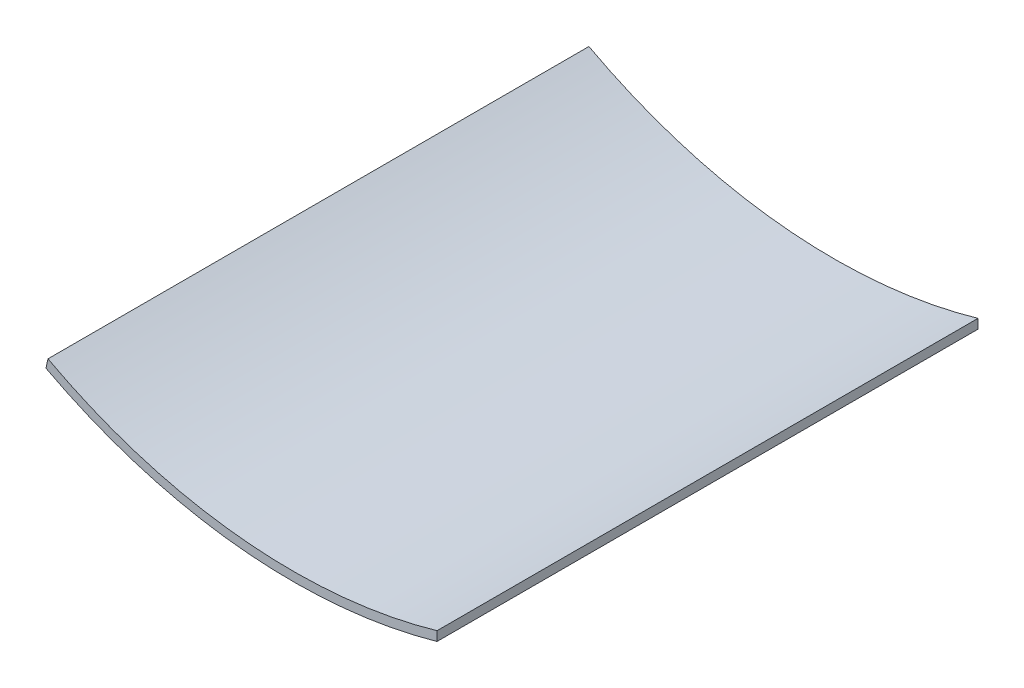
ISO-10303-21;
HEADER;
FILE_DESCRIPTION(('STEP AP214'),'2;1');
FILE_NAME('part.step','',(''),(''),'','','');
FILE_SCHEMA(('AUTOMOTIVE_DESIGN { 1 0 10303 214 1 1 1 1 }'));
ENDSEC;
DATA;
#1=APPLICATION_CONTEXT('core data for automotive mechanical design processes');
#2=APPLICATION_PROTOCOL_DEFINITION('international standard','automotive_design',2000,#1);
#3=PRODUCT_CONTEXT('',#1,'mechanical');
#4=PRODUCT('Part','Part','',(#3));
#5=PRODUCT_RELATED_PRODUCT_CATEGORY('part','',(#4));
#6=PRODUCT_DEFINITION_FORMATION('','',#4);
#7=PRODUCT_DEFINITION_CONTEXT('part definition',#1,'design');
#8=PRODUCT_DEFINITION('design','',#6,#7);
#9=PRODUCT_DEFINITION_SHAPE('','',#8);
#10=(LENGTH_UNIT() NAMED_UNIT(*) SI_UNIT(.MILLI.,.METRE.));
#11=(NAMED_UNIT(*) PLANE_ANGLE_UNIT() SI_UNIT($,.RADIAN.));
#12=(NAMED_UNIT(*) SI_UNIT($,.STERADIAN.) SOLID_ANGLE_UNIT());
#13=UNCERTAINTY_MEASURE_WITH_UNIT(LENGTH_MEASURE(1.E-05),#10,'distance_accuracy_value','');
#14=(GEOMETRIC_REPRESENTATION_CONTEXT(3) GLOBAL_UNCERTAINTY_ASSIGNED_CONTEXT((#13)) GLOBAL_UNIT_ASSIGNED_CONTEXT((#10,
#11,#12)) REPRESENTATION_CONTEXT('',''));
#15=CARTESIAN_POINT('',(0.,0.,0.));
#16=DIRECTION('',(0.,0.,1.));
#17=DIRECTION('',(1.,0.,0.));
#18=AXIS2_PLACEMENT_3D('',#15,#16,#17);
#19=CARTESIAN_POINT('',(0.,3.33066907387547E-13,190.5));
#20=DIRECTION('',(0.,0.,-1.));
#21=DIRECTION('',(-1.,0.,0.));
#22=AXIS2_PLACEMENT_3D('',#19,#20,#21);
#23=CYLINDRICAL_SURFACE('',#22,186.055);
#24=CARTESIAN_POINT('',(0.,3.33066907387547E-13,0.));
#25=DIRECTION('',(0.,0.,1.));
#26=DIRECTION('',(1.,0.,0.));
#27=AXIS2_PLACEMENT_3D('',#24,#25,#26);
#28=CIRCLE('',#27,186.055);
#29=CARTESIAN_POINT('',(-86.9030840778277,-164.512361246084,0.));
#30=VERTEX_POINT('',#29);
#31=CARTESIAN_POINT('',(50.8,-178.985538591809,0.));
#32=VERTEX_POINT('',#31);
#33=EDGE_CURVE('E115',#30,#32,#28,.T.);
#34=ORIENTED_EDGE('',*,*,#33,.T.);
#35=DIRECTION('',(0.,0.,-1.));
#36=VECTOR('',#35,1.);
#37=CARTESIAN_POINT('',(50.8,-178.985538591809,190.5));
#38=LINE('',#37,#36);
#39=CARTESIAN_POINT('',(50.8,-178.985538591809,190.5));
#40=VERTEX_POINT('',#39);
#41=EDGE_CURVE('E11',#40,#32,#38,.T.);
#42=ORIENTED_EDGE('',*,*,#41,.F.);
#43=CARTESIAN_POINT('',(0.,3.33066907387547E-13,190.5));
#44=DIRECTION('',(0.,0.,1.));
#45=DIRECTION('',(1.,0.,0.));
#46=AXIS2_PLACEMENT_3D('',#43,#44,#45);
#47=CIRCLE('',#46,186.055);
#48=CARTESIAN_POINT('',(-86.9030840778277,-164.512361246084,190.5));
#49=VERTEX_POINT('',#48);
#50=EDGE_CURVE('E99',#49,#40,#47,.T.);
#51=ORIENTED_EDGE('',*,*,#50,.F.);
#52=DIRECTION('',(0.,0.,-1.));
#53=VECTOR('',#52,1.);
#54=CARTESIAN_POINT('',(-86.9030840778277,-164.512361246084,190.5));
#55=LINE('',#54,#53);
#56=EDGE_CURVE('E111',#49,#30,#55,.T.);
#57=ORIENTED_EDGE('',*,*,#56,.T.);
#58=EDGE_LOOP('',(#34,#42,#51,#57));
#59=FACE_BOUND('',#58,.T.);
#60=ADVANCED_FACE('F47',(#59),#23,.T.);
#61=CARTESIAN_POINT('',(50.8,-178.985538591809,190.5));
#62=DIRECTION('',(-1.,0.,0.));
#63=DIRECTION('',(0.,0.,1.));
#64=AXIS2_PLACEMENT_3D('',#61,#62,#63);
#65=PLANE('',#64);
#66=DIRECTION('',(0.,1.,0.));
#67=VECTOR('',#66,1.);
#68=CARTESIAN_POINT('',(50.8,-178.985538591809,0.));
#69=LINE('',#68,#67);
#70=CARTESIAN_POINT('',(50.8,-175.682823292432,0.));
#71=VERTEX_POINT('',#70);
#72=EDGE_CURVE('E104',#32,#71,#69,.T.);
#73=ORIENTED_EDGE('',*,*,#72,.T.);
#74=DIRECTION('',(0.,0.,-1.));
#75=VECTOR('',#74,1.);
#76=CARTESIAN_POINT('',(50.8,-175.682823292432,190.5));
#77=LINE('',#76,#75);
#78=CARTESIAN_POINT('',(50.8,-175.682823292432,190.5));
#79=VERTEX_POINT('',#78);
#80=EDGE_CURVE('E56',#79,#71,#77,.T.);
#81=ORIENTED_EDGE('',*,*,#80,.F.);
#82=DIRECTION('',(0.,1.,0.));
#83=VECTOR('',#82,1.);
#84=CARTESIAN_POINT('',(50.8,-178.985538591809,190.5));
#85=LINE('',#84,#83);
#86=EDGE_CURVE('E94',#40,#79,#85,.T.);
#87=ORIENTED_EDGE('',*,*,#86,.F.);
#88=ORIENTED_EDGE('',*,*,#41,.T.);
#89=EDGE_LOOP('',(#73,#81,#87,#88));
#90=FACE_BOUND('',#89,.T.);
#91=ADVANCED_FACE('F103',(#90),#65,.F.);
#92=CARTESIAN_POINT('',(4.33680868994202E-13,2.02615701994091E-12,190.5));
#93=DIRECTION('',(0.,0.,-1.));
#94=DIRECTION('',(-1.,0.,0.));
#95=AXIS2_PLACEMENT_3D('',#92,#93,#94);
#96=CYLINDRICAL_SURFACE('',#95,182.880000000002);
#97=CARTESIAN_POINT('',(4.33680868994202E-13,2.02615701994091E-12,0.));
#98=DIRECTION('',(0.,0.,-1.));
#99=DIRECTION('',(1.,0.,0.));
#100=AXIS2_PLACEMENT_3D('',#97,#98,#99);
#101=CIRCLE('',#100,182.880000000002);
#102=CARTESIAN_POINT('',(-86.2164109556446,-161.281818200092,0.));
#103=VERTEX_POINT('',#102);
#104=EDGE_CURVE('E81',#71,#103,#101,.T.);
#105=ORIENTED_EDGE('',*,*,#104,.T.);
#106=DIRECTION('',(0.,0.,-1.));
#107=VECTOR('',#106,1.);
#108=CARTESIAN_POINT('',(-86.2164109556446,-161.281818200092,190.5));
#109=LINE('',#108,#107);
#110=CARTESIAN_POINT('',(-86.2164109556446,-161.281818200092,190.5));
#111=VERTEX_POINT('',#110);
#112=EDGE_CURVE('E106',#111,#103,#109,.T.);
#113=ORIENTED_EDGE('',*,*,#112,.F.);
#114=CARTESIAN_POINT('',(4.33680868994202E-13,2.02615701994091E-12,190.5));
#115=DIRECTION('',(0.,0.,-1.));
#116=DIRECTION('',(1.,0.,0.));
#117=AXIS2_PLACEMENT_3D('',#114,#115,#116);
#118=CIRCLE('',#117,182.880000000002);
#119=EDGE_CURVE('E97',#79,#111,#118,.T.);
#120=ORIENTED_EDGE('',*,*,#119,.F.);
#121=ORIENTED_EDGE('',*,*,#80,.T.);
#122=EDGE_LOOP('',(#105,#113,#120,#121));
#123=FACE_BOUND('',#122,.T.);
#124=ADVANCED_FACE('F107',(#123),#96,.F.);
#125=CARTESIAN_POINT('',(-86.9030840778277,-164.512361246084,190.5));
#126=DIRECTION('',(0.978147600733806,-0.207911690817756,0.));
#127=DIRECTION('',(0.207911690817756,0.978147600733806,0.));
#128=AXIS2_PLACEMENT_3D('',#125,#126,#127);
#129=PLANE('',#128);
#130=DIRECTION('',(-0.207911690817756,-0.978147600733807,0.));
#131=VECTOR('',#130,1.);
#132=CARTESIAN_POINT('',(-86.9030840778277,-164.512361246084,0.));
#133=LINE('',#132,#131);
#134=EDGE_CURVE('E87',#103,#30,#133,.T.);
#135=ORIENTED_EDGE('',*,*,#134,.T.);
#136=ORIENTED_EDGE('',*,*,#56,.F.);
#137=DIRECTION('',(-0.207911690817756,-0.978147600733807,0.));
#138=VECTOR('',#137,1.);
#139=CARTESIAN_POINT('',(-86.9030840778277,-164.512361246084,190.5));
#140=LINE('',#139,#138);
#141=EDGE_CURVE('E64',#111,#49,#140,.T.);
#142=ORIENTED_EDGE('',*,*,#141,.F.);
#143=ORIENTED_EDGE('',*,*,#112,.T.);
#144=EDGE_LOOP('',(#135,#136,#142,#143));
#145=FACE_BOUND('',#144,.T.);
#146=ADVANCED_FACE('F128',(#145),#129,.F.);
#147=CARTESIAN_POINT('',(0.,3.33066907387547E-13,190.5));
#148=DIRECTION('',(0.,0.,1.));
#149=DIRECTION('',(1.,0.,0.));
#150=AXIS2_PLACEMENT_3D('',#147,#148,#149);
#151=PLANE('',#150);
#152=ORIENTED_EDGE('',*,*,#50,.T.);
#153=ORIENTED_EDGE('',*,*,#86,.T.);
#154=ORIENTED_EDGE('',*,*,#119,.T.);
#155=ORIENTED_EDGE('',*,*,#141,.T.);
#156=EDGE_LOOP('',(#152,#153,#154,#155));
#157=FACE_BOUND('',#156,.T.);
#158=ADVANCED_FACE('F95',(#157),#151,.T.);
#159=CARTESIAN_POINT('',(0.,3.33066907387547E-13,0.));
#160=DIRECTION('',(0.,0.,1.));
#161=DIRECTION('',(1.,0.,0.));
#162=AXIS2_PLACEMENT_3D('',#159,#160,#161);
#163=PLANE('',#162);
#164=ORIENTED_EDGE('',*,*,#33,.F.);
#165=ORIENTED_EDGE('',*,*,#134,.F.);
#166=ORIENTED_EDGE('',*,*,#104,.F.);
#167=ORIENTED_EDGE('',*,*,#72,.F.);
#168=EDGE_LOOP('',(#164,#165,#166,#167));
#169=FACE_BOUND('',#168,.T.);
#170=ADVANCED_FACE('F131',(#169),#163,.F.);
#171=CLOSED_SHELL('',(#60,#91,#124,#146,#158,#170));
#172=MANIFOLD_SOLID_BREP('B2',#171);
#173=ADVANCED_BREP_SHAPE_REPRESENTATION('',(#18,#172),#14);
#174=SHAPE_DEFINITION_REPRESENTATION(#9,#173);
ENDSEC;
END-ISO-10303-21;
